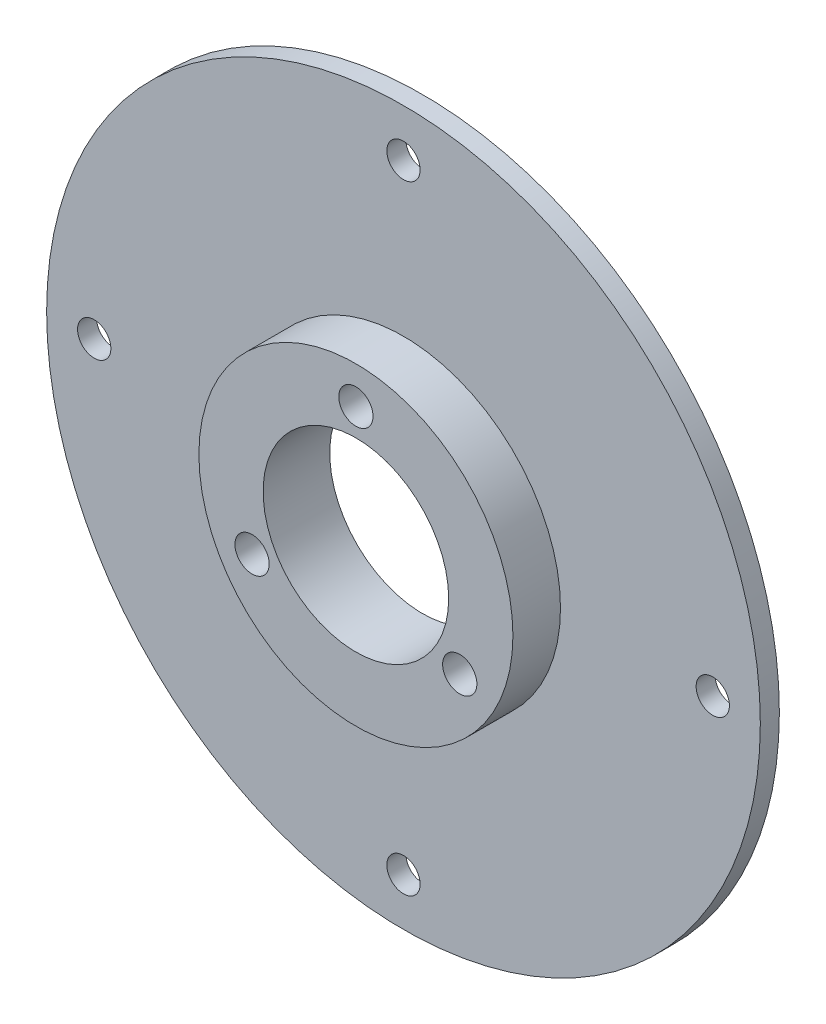
ISO-10303-21;
HEADER;
FILE_DESCRIPTION(('STEP AP214'),'2;1');
FILE_NAME('part.step','',(''),(''),'','','');
FILE_SCHEMA(('AUTOMOTIVE_DESIGN { 1 0 10303 214 1 1 1 1 }'));
ENDSEC;
DATA;
#1=APPLICATION_CONTEXT('core data for automotive mechanical design processes');
#2=APPLICATION_PROTOCOL_DEFINITION('international standard','automotive_design',2000,#1);
#3=PRODUCT_CONTEXT('',#1,'mechanical');
#4=PRODUCT('Part','Part','',(#3));
#5=PRODUCT_RELATED_PRODUCT_CATEGORY('part','',(#4));
#6=PRODUCT_DEFINITION_FORMATION('','',#4);
#7=PRODUCT_DEFINITION_CONTEXT('part definition',#1,'design');
#8=PRODUCT_DEFINITION('design','',#6,#7);
#9=PRODUCT_DEFINITION_SHAPE('','',#8);
#10=(LENGTH_UNIT() NAMED_UNIT(*) SI_UNIT(.MILLI.,.METRE.));
#11=(NAMED_UNIT(*) PLANE_ANGLE_UNIT() SI_UNIT($,.RADIAN.));
#12=(NAMED_UNIT(*) SI_UNIT($,.STERADIAN.) SOLID_ANGLE_UNIT());
#13=UNCERTAINTY_MEASURE_WITH_UNIT(LENGTH_MEASURE(1.E-05),#10,'distance_accuracy_value','');
#14=(GEOMETRIC_REPRESENTATION_CONTEXT(3) GLOBAL_UNCERTAINTY_ASSIGNED_CONTEXT((#13)) GLOBAL_UNIT_ASSIGNED_CONTEXT((#10,
#11,#12)) REPRESENTATION_CONTEXT('',''));
#15=CARTESIAN_POINT('',(0.,0.,0.));
#16=DIRECTION('',(0.,0.,1.));
#17=DIRECTION('',(1.,0.,0.));
#18=AXIS2_PLACEMENT_3D('',#15,#16,#17);
#19=CARTESIAN_POINT('',(0.,0.,2.));
#20=DIRECTION('',(0.,0.,-1.));
#21=DIRECTION('',(-1.,0.,0.));
#22=AXIS2_PLACEMENT_3D('',#19,#20,#21);
#23=CYLINDRICAL_SURFACE('',#22,37.5);
#24=CARTESIAN_POINT('',(0.,0.,2.));
#25=DIRECTION('',(0.,0.,1.));
#26=DIRECTION('',(1.,0.,0.));
#27=AXIS2_PLACEMENT_3D('',#24,#25,#26);
#28=CIRCLE('',#27,37.5);
#29=CARTESIAN_POINT('',(37.5,0.,2.));
#30=VERTEX_POINT('',#29);
#31=EDGE_CURVE('E10',#30,#30,#28,.T.);
#32=ORIENTED_EDGE('',*,*,#31,.F.);
#33=EDGE_LOOP('',(#32));
#34=FACE_BOUND('',#33,.T.);
#35=CARTESIAN_POINT('',(0.,0.,0.));
#36=DIRECTION('',(0.,0.,1.));
#37=DIRECTION('',(1.,0.,0.));
#38=AXIS2_PLACEMENT_3D('',#35,#36,#37);
#39=CIRCLE('',#38,37.5);
#40=CARTESIAN_POINT('',(37.5,0.,0.));
#41=VERTEX_POINT('',#40);
#42=EDGE_CURVE('E42',#41,#41,#39,.T.);
#43=ORIENTED_EDGE('',*,*,#42,.T.);
#44=EDGE_LOOP('',(#43));
#45=FACE_BOUND('',#44,.T.);
#46=ADVANCED_FACE('F39',(#34,#45),#23,.T.);
#47=CARTESIAN_POINT('',(0.,0.,2.));
#48=DIRECTION('',(0.,0.,1.));
#49=DIRECTION('',(1.,0.,0.));
#50=AXIS2_PLACEMENT_3D('',#47,#48,#49);
#51=PLANE('',#50);
#52=CARTESIAN_POINT('',(0.,0.,2.));
#53=DIRECTION('',(0.,0.,1.));
#54=DIRECTION('',(1.,0.,0.));
#55=AXIS2_PLACEMENT_3D('',#52,#53,#54);
#56=CIRCLE('',#55,16.5);
#57=CARTESIAN_POINT('',(16.5,0.,2.));
#58=VERTEX_POINT('',#57);
#59=EDGE_CURVE('E85',#58,#58,#56,.T.);
#60=ORIENTED_EDGE('',*,*,#59,.F.);
#61=EDGE_LOOP('',(#60));
#62=FACE_BOUND('',#61,.T.);
#63=CARTESIAN_POINT('',(0.,32.5,2.));
#64=DIRECTION('',(0.,0.,1.));
#65=DIRECTION('',(1.,0.,0.));
#66=AXIS2_PLACEMENT_3D('',#63,#64,#65);
#67=CIRCLE('',#66,1.75);
#68=CARTESIAN_POINT('',(1.75,32.5,2.));
#69=VERTEX_POINT('',#68);
#70=EDGE_CURVE('E75',#69,#69,#67,.T.);
#71=ORIENTED_EDGE('',*,*,#70,.F.);
#72=EDGE_LOOP('',(#71));
#73=FACE_BOUND('',#72,.T.);
#74=CARTESIAN_POINT('',(32.5,0.,2.));
#75=DIRECTION('',(0.,0.,1.));
#76=DIRECTION('',(1.,0.,0.));
#77=AXIS2_PLACEMENT_3D('',#74,#75,#76);
#78=CIRCLE('',#77,1.75000000000011);
#79=CARTESIAN_POINT('',(34.2500000000001,0.,2.));
#80=VERTEX_POINT('',#79);
#81=EDGE_CURVE('E67',#80,#80,#78,.T.);
#82=ORIENTED_EDGE('',*,*,#81,.F.);
#83=EDGE_LOOP('',(#82));
#84=FACE_BOUND('',#83,.T.);
#85=CARTESIAN_POINT('',(0.,-32.5,2.));
#86=DIRECTION('',(0.,0.,1.));
#87=DIRECTION('',(1.,0.,0.));
#88=AXIS2_PLACEMENT_3D('',#85,#86,#87);
#89=CIRCLE('',#88,1.75000000000022);
#90=CARTESIAN_POINT('',(1.75000000000022,-32.5,2.));
#91=VERTEX_POINT('',#90);
#92=EDGE_CURVE('E57',#91,#91,#89,.T.);
#93=ORIENTED_EDGE('',*,*,#92,.F.);
#94=EDGE_LOOP('',(#93));
#95=FACE_BOUND('',#94,.T.);
#96=CARTESIAN_POINT('',(-32.5,0.,2.));
#97=DIRECTION('',(0.,0.,1.));
#98=DIRECTION('',(1.,0.,0.));
#99=AXIS2_PLACEMENT_3D('',#96,#97,#98);
#100=CIRCLE('',#99,1.75000000000033);
#101=CARTESIAN_POINT('',(-30.7499999999997,0.,2.));
#102=VERTEX_POINT('',#101);
#103=EDGE_CURVE('E58',#102,#102,#100,.T.);
#104=ORIENTED_EDGE('',*,*,#103,.F.);
#105=EDGE_LOOP('',(#104));
#106=FACE_BOUND('',#105,.T.);
#107=ORIENTED_EDGE('',*,*,#31,.T.);
#108=EDGE_LOOP('',(#107));
#109=FACE_BOUND('',#108,.T.);
#110=ADVANCED_FACE('F144',(#62,#73,#84,#95,#106,#109),#51,.T.);
#111=CARTESIAN_POINT('',(0.,0.,0.));
#112=DIRECTION('',(0.,0.,1.));
#113=DIRECTION('',(1.,0.,0.));
#114=AXIS2_PLACEMENT_3D('',#111,#112,#113);
#115=PLANE('',#114);
#116=CARTESIAN_POINT('',(-10.9119200876839,-6.3,0.));
#117=DIRECTION('',(0.,0.,1.));
#118=DIRECTION('',(1.,0.,0.));
#119=AXIS2_PLACEMENT_3D('',#116,#117,#118);
#120=CIRCLE('',#119,1.80000000000011);
#121=CARTESIAN_POINT('',(-9.11192008768381,-6.3,0.));
#122=VERTEX_POINT('',#121);
#123=EDGE_CURVE('E101',#122,#122,#120,.F.);
#124=ORIENTED_EDGE('',*,*,#123,.F.);
#125=EDGE_LOOP('',(#124));
#126=FACE_BOUND('',#125,.T.);
#127=CARTESIAN_POINT('',(10.9119200876839,-6.3,0.));
#128=DIRECTION('',(0.,0.,1.));
#129=DIRECTION('',(1.,0.,0.));
#130=AXIS2_PLACEMENT_3D('',#127,#128,#129);
#131=CIRCLE('',#130,1.80000000000006);
#132=CARTESIAN_POINT('',(12.711920087684,-6.3,0.));
#133=VERTEX_POINT('',#132);
#134=EDGE_CURVE('E110',#133,#133,#131,.F.);
#135=ORIENTED_EDGE('',*,*,#134,.F.);
#136=EDGE_LOOP('',(#135));
#137=FACE_BOUND('',#136,.T.);
#138=CARTESIAN_POINT('',(0.,12.6,0.));
#139=DIRECTION('',(0.,0.,1.));
#140=DIRECTION('',(1.,0.,0.));
#141=AXIS2_PLACEMENT_3D('',#138,#139,#140);
#142=CIRCLE('',#141,1.8);
#143=CARTESIAN_POINT('',(1.8,12.6,0.));
#144=VERTEX_POINT('',#143);
#145=EDGE_CURVE('E100',#144,#144,#142,.F.);
#146=ORIENTED_EDGE('',*,*,#145,.F.);
#147=EDGE_LOOP('',(#146));
#148=FACE_BOUND('',#147,.T.);
#149=CARTESIAN_POINT('',(0.,0.,0.));
#150=DIRECTION('',(0.,0.,1.));
#151=DIRECTION('',(1.,0.,0.));
#152=AXIS2_PLACEMENT_3D('',#149,#150,#151);
#153=CIRCLE('',#152,9.75);
#154=CARTESIAN_POINT('',(9.75,0.,0.));
#155=VERTEX_POINT('',#154);
#156=EDGE_CURVE('E89',#155,#155,#153,.F.);
#157=ORIENTED_EDGE('',*,*,#156,.F.);
#158=EDGE_LOOP('',(#157));
#159=FACE_BOUND('',#158,.T.);
#160=CARTESIAN_POINT('',(0.,32.5,0.));
#161=DIRECTION('',(0.,0.,1.));
#162=DIRECTION('',(1.,0.,0.));
#163=AXIS2_PLACEMENT_3D('',#160,#161,#162);
#164=CIRCLE('',#163,1.75);
#165=CARTESIAN_POINT('',(1.75,32.5,0.));
#166=VERTEX_POINT('',#165);
#167=EDGE_CURVE('E51',#166,#166,#164,.F.);
#168=ORIENTED_EDGE('',*,*,#167,.F.);
#169=EDGE_LOOP('',(#168));
#170=FACE_BOUND('',#169,.T.);
#171=CARTESIAN_POINT('',(32.5,0.,0.));
#172=DIRECTION('',(0.,0.,1.));
#173=DIRECTION('',(1.,0.,0.));
#174=AXIS2_PLACEMENT_3D('',#171,#172,#173);
#175=CIRCLE('',#174,1.75000000000011);
#176=CARTESIAN_POINT('',(34.2500000000001,0.,0.));
#177=VERTEX_POINT('',#176);
#178=EDGE_CURVE('E71',#177,#177,#175,.F.);
#179=ORIENTED_EDGE('',*,*,#178,.F.);
#180=EDGE_LOOP('',(#179));
#181=FACE_BOUND('',#180,.T.);
#182=CARTESIAN_POINT('',(0.,-32.5,0.));
#183=DIRECTION('',(0.,0.,1.));
#184=DIRECTION('',(1.,0.,0.));
#185=AXIS2_PLACEMENT_3D('',#182,#183,#184);
#186=CIRCLE('',#185,1.75000000000022);
#187=CARTESIAN_POINT('',(1.75000000000022,-32.5,0.));
#188=VERTEX_POINT('',#187);
#189=EDGE_CURVE('E63',#188,#188,#186,.F.);
#190=ORIENTED_EDGE('',*,*,#189,.F.);
#191=EDGE_LOOP('',(#190));
#192=FACE_BOUND('',#191,.T.);
#193=CARTESIAN_POINT('',(-32.5,0.,0.));
#194=DIRECTION('',(0.,0.,1.));
#195=DIRECTION('',(1.,0.,0.));
#196=AXIS2_PLACEMENT_3D('',#193,#194,#195);
#197=CIRCLE('',#196,1.75000000000033);
#198=CARTESIAN_POINT('',(-30.7499999999997,0.,0.));
#199=VERTEX_POINT('',#198);
#200=EDGE_CURVE('E53',#199,#199,#197,.F.);
#201=ORIENTED_EDGE('',*,*,#200,.F.);
#202=EDGE_LOOP('',(#201));
#203=FACE_BOUND('',#202,.T.);
#204=ORIENTED_EDGE('',*,*,#42,.F.);
#205=EDGE_LOOP('',(#204));
#206=FACE_BOUND('',#205,.T.);
#207=ADVANCED_FACE('F147',(#126,#137,#148,#159,#170,#181,#192,#203,#206),#115,.F.);
#208=CARTESIAN_POINT('',(-32.5,0.,-4.94974746830677));
#209=DIRECTION('',(0.,0.,1.));
#210=DIRECTION('',(1.,0.,0.));
#211=AXIS2_PLACEMENT_3D('',#208,#209,#210);
#212=CYLINDRICAL_SURFACE('',#211,1.75000000000033);
#213=ORIENTED_EDGE('',*,*,#200,.T.);
#214=EDGE_LOOP('',(#213));
#215=FACE_BOUND('',#214,.T.);
#216=ORIENTED_EDGE('',*,*,#103,.T.);
#217=EDGE_LOOP('',(#216));
#218=FACE_BOUND('',#217,.T.);
#219=ADVANCED_FACE('F157',(#215,#218),#212,.F.);
#220=CARTESIAN_POINT('',(0.,-32.5,-4.94974746830677));
#221=DIRECTION('',(0.,0.,1.));
#222=DIRECTION('',(1.,0.,0.));
#223=AXIS2_PLACEMENT_3D('',#220,#221,#222);
#224=CYLINDRICAL_SURFACE('',#223,1.75000000000022);
#225=ORIENTED_EDGE('',*,*,#189,.T.);
#226=EDGE_LOOP('',(#225));
#227=FACE_BOUND('',#226,.T.);
#228=ORIENTED_EDGE('',*,*,#92,.T.);
#229=EDGE_LOOP('',(#228));
#230=FACE_BOUND('',#229,.T.);
#231=ADVANCED_FACE('F159',(#227,#230),#224,.F.);
#232=CARTESIAN_POINT('',(32.5,0.,-4.94974746830677));
#233=DIRECTION('',(0.,0.,1.));
#234=DIRECTION('',(1.,0.,0.));
#235=AXIS2_PLACEMENT_3D('',#232,#233,#234);
#236=CYLINDRICAL_SURFACE('',#235,1.75000000000011);
#237=ORIENTED_EDGE('',*,*,#178,.T.);
#238=EDGE_LOOP('',(#237));
#239=FACE_BOUND('',#238,.T.);
#240=ORIENTED_EDGE('',*,*,#81,.T.);
#241=EDGE_LOOP('',(#240));
#242=FACE_BOUND('',#241,.T.);
#243=ADVANCED_FACE('F166',(#239,#242),#236,.F.);
#244=CARTESIAN_POINT('',(0.,32.5,-4.94974746830677));
#245=DIRECTION('',(0.,0.,1.));
#246=DIRECTION('',(1.,0.,0.));
#247=AXIS2_PLACEMENT_3D('',#244,#245,#246);
#248=CYLINDRICAL_SURFACE('',#247,1.75);
#249=ORIENTED_EDGE('',*,*,#167,.T.);
#250=EDGE_LOOP('',(#249));
#251=FACE_BOUND('',#250,.T.);
#252=ORIENTED_EDGE('',*,*,#70,.T.);
#253=EDGE_LOOP('',(#252));
#254=FACE_BOUND('',#253,.T.);
#255=ADVANCED_FACE('F140',(#251,#254),#248,.F.);
#256=CARTESIAN_POINT('',(0.,0.,7.));
#257=DIRECTION('',(0.,0.,-1.));
#258=DIRECTION('',(-1.,0.,0.));
#259=AXIS2_PLACEMENT_3D('',#256,#257,#258);
#260=CYLINDRICAL_SURFACE('',#259,16.5);
#261=CARTESIAN_POINT('',(0.,0.,7.));
#262=DIRECTION('',(0.,0.,1.));
#263=DIRECTION('',(1.,0.,0.));
#264=AXIS2_PLACEMENT_3D('',#261,#262,#263);
#265=CIRCLE('',#264,16.5);
#266=CARTESIAN_POINT('',(16.5,0.,7.));
#267=VERTEX_POINT('',#266);
#268=EDGE_CURVE('E62',#267,#267,#265,.T.);
#269=ORIENTED_EDGE('',*,*,#268,.F.);
#270=EDGE_LOOP('',(#269));
#271=FACE_BOUND('',#270,.T.);
#272=ORIENTED_EDGE('',*,*,#59,.T.);
#273=EDGE_LOOP('',(#272));
#274=FACE_BOUND('',#273,.T.);
#275=ADVANCED_FACE('F131',(#271,#274),#260,.T.);
#276=CARTESIAN_POINT('',(0.,0.,7.));
#277=DIRECTION('',(0.,0.,1.));
#278=DIRECTION('',(1.,0.,0.));
#279=AXIS2_PLACEMENT_3D('',#276,#277,#278);
#280=PLANE('',#279);
#281=CARTESIAN_POINT('',(-10.9119200876839,-6.3,7.));
#282=DIRECTION('',(0.,0.,1.));
#283=DIRECTION('',(1.,0.,0.));
#284=AXIS2_PLACEMENT_3D('',#281,#282,#283);
#285=CIRCLE('',#284,1.80000000000011);
#286=CARTESIAN_POINT('',(-9.11192008768381,-6.3,7.));
#287=VERTEX_POINT('',#286);
#288=EDGE_CURVE('E106',#287,#287,#285,.T.);
#289=ORIENTED_EDGE('',*,*,#288,.F.);
#290=EDGE_LOOP('',(#289));
#291=FACE_BOUND('',#290,.T.);
#292=CARTESIAN_POINT('',(10.9119200876839,-6.3,7.));
#293=DIRECTION('',(0.,0.,1.));
#294=DIRECTION('',(1.,0.,0.));
#295=AXIS2_PLACEMENT_3D('',#292,#293,#294);
#296=CIRCLE('',#295,1.80000000000006);
#297=CARTESIAN_POINT('',(12.711920087684,-6.3,7.));
#298=VERTEX_POINT('',#297);
#299=EDGE_CURVE('E105',#298,#298,#296,.T.);
#300=ORIENTED_EDGE('',*,*,#299,.F.);
#301=EDGE_LOOP('',(#300));
#302=FACE_BOUND('',#301,.T.);
#303=CARTESIAN_POINT('',(0.,12.6,7.));
#304=DIRECTION('',(0.,0.,1.));
#305=DIRECTION('',(1.,0.,0.));
#306=AXIS2_PLACEMENT_3D('',#303,#304,#305);
#307=CIRCLE('',#306,1.8);
#308=CARTESIAN_POINT('',(1.8,12.6,7.));
#309=VERTEX_POINT('',#308);
#310=EDGE_CURVE('E114',#309,#309,#307,.T.);
#311=ORIENTED_EDGE('',*,*,#310,.F.);
#312=EDGE_LOOP('',(#311));
#313=FACE_BOUND('',#312,.T.);
#314=CARTESIAN_POINT('',(0.,0.,7.));
#315=DIRECTION('',(0.,0.,1.));
#316=DIRECTION('',(1.,0.,0.));
#317=AXIS2_PLACEMENT_3D('',#314,#315,#316);
#318=CIRCLE('',#317,9.75);
#319=CARTESIAN_POINT('',(9.75,0.,7.));
#320=VERTEX_POINT('',#319);
#321=EDGE_CURVE('E96',#320,#320,#318,.T.);
#322=ORIENTED_EDGE('',*,*,#321,.F.);
#323=EDGE_LOOP('',(#322));
#324=FACE_BOUND('',#323,.T.);
#325=ORIENTED_EDGE('',*,*,#268,.T.);
#326=EDGE_LOOP('',(#325));
#327=FACE_BOUND('',#326,.T.);
#328=ADVANCED_FACE('F127',(#291,#302,#313,#324,#327),#280,.T.);
#329=CARTESIAN_POINT('',(0.,0.,-27.5771644662754));
#330=DIRECTION('',(0.,0.,1.));
#331=DIRECTION('',(1.,0.,0.));
#332=AXIS2_PLACEMENT_3D('',#329,#330,#331);
#333=CYLINDRICAL_SURFACE('',#332,9.75);
#334=ORIENTED_EDGE('',*,*,#156,.T.);
#335=EDGE_LOOP('',(#334));
#336=FACE_BOUND('',#335,.T.);
#337=ORIENTED_EDGE('',*,*,#321,.T.);
#338=EDGE_LOOP('',(#337));
#339=FACE_BOUND('',#338,.T.);
#340=ADVANCED_FACE('F130',(#336,#339),#333,.F.);
#341=CARTESIAN_POINT('',(0.,12.6,-27.5771644662754));
#342=DIRECTION('',(0.,0.,1.));
#343=DIRECTION('',(1.,0.,0.));
#344=AXIS2_PLACEMENT_3D('',#341,#342,#343);
#345=CYLINDRICAL_SURFACE('',#344,1.8);
#346=ORIENTED_EDGE('',*,*,#145,.T.);
#347=EDGE_LOOP('',(#346));
#348=FACE_BOUND('',#347,.T.);
#349=ORIENTED_EDGE('',*,*,#310,.T.);
#350=EDGE_LOOP('',(#349));
#351=FACE_BOUND('',#350,.T.);
#352=ADVANCED_FACE('F125',(#348,#351),#345,.F.);
#353=CARTESIAN_POINT('',(10.9119200876839,-6.3,-27.5771644662754));
#354=DIRECTION('',(0.,0.,1.));
#355=DIRECTION('',(1.,0.,0.));
#356=AXIS2_PLACEMENT_3D('',#353,#354,#355);
#357=CYLINDRICAL_SURFACE('',#356,1.80000000000006);
#358=ORIENTED_EDGE('',*,*,#134,.T.);
#359=EDGE_LOOP('',(#358));
#360=FACE_BOUND('',#359,.T.);
#361=ORIENTED_EDGE('',*,*,#299,.T.);
#362=EDGE_LOOP('',(#361));
#363=FACE_BOUND('',#362,.T.);
#364=ADVANCED_FACE('F214',(#360,#363),#357,.F.);
#365=CARTESIAN_POINT('',(-10.9119200876839,-6.3,-27.5771644662754));
#366=DIRECTION('',(0.,0.,1.));
#367=DIRECTION('',(1.,0.,0.));
#368=AXIS2_PLACEMENT_3D('',#365,#366,#367);
#369=CYLINDRICAL_SURFACE('',#368,1.80000000000011);
#370=ORIENTED_EDGE('',*,*,#123,.T.);
#371=EDGE_LOOP('',(#370));
#372=FACE_BOUND('',#371,.T.);
#373=ORIENTED_EDGE('',*,*,#288,.T.);
#374=EDGE_LOOP('',(#373));
#375=FACE_BOUND('',#374,.T.);
#376=ADVANCED_FACE('F224',(#372,#375),#369,.F.);
#377=CLOSED_SHELL('',(#46,#110,#207,#219,#231,#243,#255,#275,#328,#340,#352,#364,#376));
#378=MANIFOLD_SOLID_BREP('B2',#377);
#379=ADVANCED_BREP_SHAPE_REPRESENTATION('',(#18,#378),#14);
#380=SHAPE_DEFINITION_REPRESENTATION(#9,#379);
ENDSEC;
END-ISO-10303-21;
